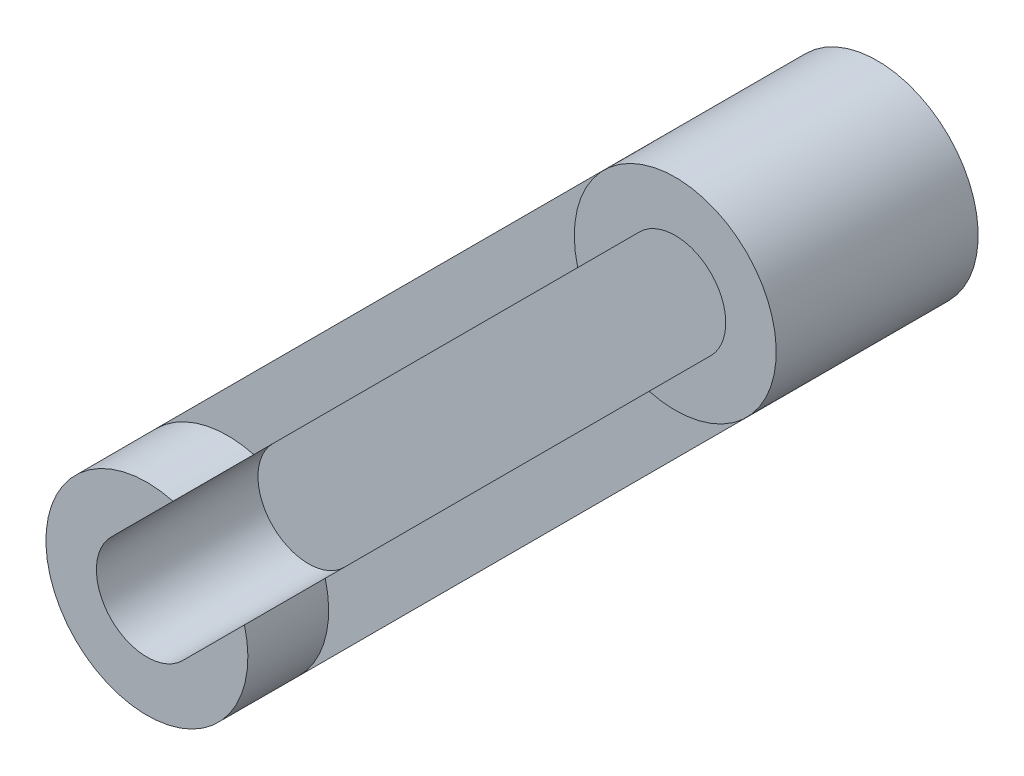
ISO-10303-21;
HEADER;
FILE_DESCRIPTION(('STEP AP214'),'2;1');
FILE_NAME('part.step','',(''),(''),'','','');
FILE_SCHEMA(('AUTOMOTIVE_DESIGN { 1 0 10303 214 1 1 1 1 }'));
ENDSEC;
DATA;
#1=APPLICATION_CONTEXT('core data for automotive mechanical design processes');
#2=APPLICATION_PROTOCOL_DEFINITION('international standard','automotive_design',2000,#1);
#3=PRODUCT_CONTEXT('',#1,'mechanical');
#4=PRODUCT('Part','Part','',(#3));
#5=PRODUCT_RELATED_PRODUCT_CATEGORY('part','',(#4));
#6=PRODUCT_DEFINITION_FORMATION('','',#4);
#7=PRODUCT_DEFINITION_CONTEXT('part definition',#1,'design');
#8=PRODUCT_DEFINITION('design','',#6,#7);
#9=PRODUCT_DEFINITION_SHAPE('','',#8);
#10=(LENGTH_UNIT() NAMED_UNIT(*) SI_UNIT(.MILLI.,.METRE.));
#11=(NAMED_UNIT(*) PLANE_ANGLE_UNIT() SI_UNIT($,.RADIAN.));
#12=(NAMED_UNIT(*) SI_UNIT($,.STERADIAN.) SOLID_ANGLE_UNIT());
#13=UNCERTAINTY_MEASURE_WITH_UNIT(LENGTH_MEASURE(1.E-05),#10,'distance_accuracy_value','');
#14=(GEOMETRIC_REPRESENTATION_CONTEXT(3) GLOBAL_UNCERTAINTY_ASSIGNED_CONTEXT((#13)) GLOBAL_UNIT_ASSIGNED_CONTEXT((#10,
#11,#12)) REPRESENTATION_CONTEXT('',''));
#15=CARTESIAN_POINT('',(0.,0.,0.));
#16=DIRECTION('',(0.,0.,1.));
#17=DIRECTION('',(1.,0.,0.));
#18=AXIS2_PLACEMENT_3D('',#15,#16,#17);
#19=CARTESIAN_POINT('',(-37.4408108069838,-24.9610251177916,10.));
#20=DIRECTION('',(0.,0.,-1.));
#21=DIRECTION('',(-1.,0.,0.));
#22=AXIS2_PLACEMENT_3D('',#19,#20,#21);
#23=CYLINDRICAL_SURFACE('',#22,2.49999999999967);
#24=DIRECTION('',(0.,0.,1.));
#25=VECTOR('',#24,1.);
#26=CARTESIAN_POINT('',(-39.2085777599503,-23.1932581648256,2.));
#27=LINE('',#26,#25);
#28=CARTESIAN_POINT('',(-39.2085777599503,-23.1932581648256,2.));
#29=VERTEX_POINT('',#28);
#30=CARTESIAN_POINT('',(-39.2085777599503,-23.1932581648256,10.));
#31=VERTEX_POINT('',#30);
#32=EDGE_CURVE('E122',#29,#31,#27,.T.);
#33=ORIENTED_EDGE('',*,*,#32,.T.);
#34=CARTESIAN_POINT('',(-37.4408108069838,-24.9610251177916,10.));
#35=DIRECTION('',(0.,0.,1.));
#36=DIRECTION('',(1.,0.,0.));
#37=AXIS2_PLACEMENT_3D('',#34,#35,#36);
#38=CIRCLE('',#37,2.49999999999967);
#39=CARTESIAN_POINT('',(-35.6730438540174,-26.728792070758,10.));
#40=VERTEX_POINT('',#39);
#41=EDGE_CURVE('E126',#31,#40,#38,.T.);
#42=ORIENTED_EDGE('',*,*,#41,.T.);
#43=DIRECTION('',(0.,0.,-1.));
#44=VECTOR('',#43,1.);
#45=CARTESIAN_POINT('',(-35.6730438540177,-26.7287920707578,10.));
#46=LINE('',#45,#44);
#47=CARTESIAN_POINT('',(-35.6730438540178,-26.7287920707577,2.));
#48=VERTEX_POINT('',#47);
#49=EDGE_CURVE('E154',#40,#48,#46,.T.);
#50=ORIENTED_EDGE('',*,*,#49,.T.);
#51=CARTESIAN_POINT('',(-37.4408108069839,-24.9610251177915,2.));
#52=DIRECTION('',(0.,0.,-1.));
#53=DIRECTION('',(-1.,0.,0.));
#54=AXIS2_PLACEMENT_3D('',#51,#52,#53);
#55=CIRCLE('',#54,2.49999999999973);
#56=EDGE_CURVE('E127',#48,#29,#55,.T.);
#57=ORIENTED_EDGE('',*,*,#56,.T.);
#58=EDGE_LOOP('',(#33,#42,#50,#57));
#59=FACE_BOUND('',#58,.T.);
#60=ADVANCED_FACE('F32',(#59),#23,.F.);
#61=CARTESIAN_POINT('',(-11.2778599030814,1.20192578611049,10.));
#62=DIRECTION('',(0.,0.,-1.));
#63=DIRECTION('',(-1.,0.,0.));
#64=AXIS2_PLACEMENT_3D('',#61,#62,#63);
#65=CYLINDRICAL_SURFACE('',#64,2.49999999999992);
#66=CARTESIAN_POINT('',(-11.2778599030814,1.20192578611049,10.));
#67=DIRECTION('',(0.,0.,1.));
#68=DIRECTION('',(1.,0.,0.));
#69=AXIS2_PLACEMENT_3D('',#66,#67,#68);
#70=CIRCLE('',#69,2.49999999999992);
#71=CARTESIAN_POINT('',(-9.51009295011515,-0.565841166855722,10.));
#72=VERTEX_POINT('',#71);
#73=CARTESIAN_POINT('',(-13.045626856048,2.96969273907715,10.));
#74=VERTEX_POINT('',#73);
#75=EDGE_CURVE('E179',#72,#74,#70,.T.);
#76=ORIENTED_EDGE('',*,*,#75,.T.);
#77=DIRECTION('',(0.,0.,1.));
#78=VECTOR('',#77,1.);
#79=CARTESIAN_POINT('',(-13.045626856048,2.96969273907715,2.));
#80=LINE('',#79,#78);
#81=CARTESIAN_POINT('',(-13.045626856048,2.96969273907715,2.));
#82=VERTEX_POINT('',#81);
#83=EDGE_CURVE('E131',#82,#74,#80,.T.);
#84=ORIENTED_EDGE('',*,*,#83,.F.);
#85=CARTESIAN_POINT('',(-11.2778599030814,1.20192578611049,2.));
#86=DIRECTION('',(0.,0.,-1.));
#87=DIRECTION('',(-1.,0.,0.));
#88=AXIS2_PLACEMENT_3D('',#85,#86,#87);
#89=CIRCLE('',#88,2.50000000000017);
#90=CARTESIAN_POINT('',(-9.51009295011489,-0.565841166855988,2.));
#91=VERTEX_POINT('',#90);
#92=EDGE_CURVE('E252',#82,#91,#89,.T.);
#93=ORIENTED_EDGE('',*,*,#92,.T.);
#94=DIRECTION('',(0.,0.,-1.));
#95=VECTOR('',#94,1.);
#96=CARTESIAN_POINT('',(-9.51009295011507,-0.565841166855805,10.));
#97=LINE('',#96,#95);
#98=EDGE_CURVE('E186',#72,#91,#97,.T.);
#99=ORIENTED_EDGE('',*,*,#98,.F.);
#100=EDGE_LOOP('',(#76,#84,#93,#99));
#101=FACE_BOUND('',#100,.T.);
#102=ADVANCED_FACE('F214',(#101),#65,.F.);
#103=CARTESIAN_POINT('',(-11.2778599030814,1.20192578611049,10.));
#104=DIRECTION('',(0.,0.,-1.));
#105=DIRECTION('',(-1.,0.,0.));
#106=AXIS2_PLACEMENT_3D('',#103,#104,#105);
#107=CYLINDRICAL_SURFACE('',#106,4.99999999999992);
#108=DIRECTION('',(0.,0.,-1.));
#109=VECTOR('',#108,1.);
#110=CARTESIAN_POINT('',(-16.1074890345268,-0.092169439401641,10.));
#111=LINE('',#110,#109);
#112=CARTESIAN_POINT('',(-16.1074890345268,-0.0921694394016501,10.));
#113=VERTEX_POINT('',#112);
#114=CARTESIAN_POINT('',(-16.1074890345268,-0.0921694394016501,6.));
#115=VERTEX_POINT('',#114);
#116=EDGE_CURVE('E211',#113,#115,#111,.T.);
#117=ORIENTED_EDGE('',*,*,#116,.F.);
#118=CARTESIAN_POINT('',(-11.2778599030814,1.20192578611049,10.));
#119=DIRECTION('',(0.,0.,1.));
#120=DIRECTION('',(1.,0.,0.));
#121=AXIS2_PLACEMENT_3D('',#118,#119,#120);
#122=CIRCLE('',#121,4.99999999999992);
#123=CARTESIAN_POINT('',(-12.5719551285942,-3.62770334533473,10.));
#124=VERTEX_POINT('',#123);
#125=EDGE_CURVE('E183',#124,#113,#122,.T.);
#126=ORIENTED_EDGE('',*,*,#125,.F.);
#127=DIRECTION('',(0.,0.,-1.));
#128=VECTOR('',#127,1.);
#129=CARTESIAN_POINT('',(-12.5719551285942,-3.62770334533473,10.));
#130=LINE('',#129,#128);
#131=CARTESIAN_POINT('',(-12.5719551285942,-3.62770334533472,6.));
#132=VERTEX_POINT('',#131);
#133=EDGE_CURVE('E264',#132,#124,#130,.F.);
#134=ORIENTED_EDGE('',*,*,#133,.F.);
#135=CARTESIAN_POINT('',(-11.2778599030814,1.20192578611049,6.));
#136=DIRECTION('',(0.,0.,1.));
#137=DIRECTION('',(1.,0.,0.));
#138=AXIS2_PLACEMENT_3D('',#135,#136,#137);
#139=CIRCLE('',#138,4.99999999999992);
#140=CARTESIAN_POINT('',(-7.74232599714873,-2.33360811982222,6.));
#141=VERTEX_POINT('',#140);
#142=EDGE_CURVE('E47',#132,#141,#139,.T.);
#143=ORIENTED_EDGE('',*,*,#142,.T.);
#144=DIRECTION('',(0.,0.,-1.));
#145=VECTOR('',#144,1.);
#146=CARTESIAN_POINT('',(-7.74232599714877,-2.33360811982225,6.));
#147=LINE('',#146,#145);
#148=CARTESIAN_POINT('',(-7.74232599714877,-2.33360811982225,0.));
#149=VERTEX_POINT('',#148);
#150=EDGE_CURVE('E165',#141,#149,#147,.T.);
#151=ORIENTED_EDGE('',*,*,#150,.T.);
#152=CARTESIAN_POINT('',(-11.2778599030814,1.20192578611049,0.));
#153=DIRECTION('',(0.,0.,1.));
#154=DIRECTION('',(1.,0.,0.));
#155=AXIS2_PLACEMENT_3D('',#152,#153,#154);
#156=CIRCLE('',#155,4.99999999999992);
#157=CARTESIAN_POINT('',(-14.8133938090141,4.73745969204318,0.));
#158=VERTEX_POINT('',#157);
#159=EDGE_CURVE('E182',#149,#158,#156,.T.);
#160=ORIENTED_EDGE('',*,*,#159,.T.);
#161=DIRECTION('',(0.,0.,-1.));
#162=VECTOR('',#161,1.);
#163=CARTESIAN_POINT('',(-14.8133938090141,4.73745969204314,6.));
#164=LINE('',#163,#162);
#165=CARTESIAN_POINT('',(-14.8133938090141,4.73745969204318,6.));
#166=VERTEX_POINT('',#165);
#167=EDGE_CURVE('E54',#166,#158,#164,.T.);
#168=ORIENTED_EDGE('',*,*,#167,.F.);
#169=EDGE_CURVE('E177',#166,#115,#139,.T.);
#170=ORIENTED_EDGE('',*,*,#169,.T.);
#171=EDGE_LOOP('',(#117,#126,#134,#143,#151,#160,#168,#170));
#172=FACE_BOUND('',#171,.T.);
#173=ADVANCED_FACE('F34',(#172),#107,.T.);
#174=CARTESIAN_POINT('',(-11.2778599030814,1.20192578611049,10.));
#175=DIRECTION('',(0.,0.,1.));
#176=DIRECTION('',(1.,0.,0.));
#177=AXIS2_PLACEMENT_3D('',#174,#175,#176);
#178=PLANE('',#177);
#179=ORIENTED_EDGE('',*,*,#125,.T.);
#180=DIRECTION('',(-0.707106781186542,-0.707106781186553,0.));
#181=VECTOR('',#180,1.);
#182=CARTESIAN_POINT('',(-39.2085777599503,-23.1932581648256,10.));
#183=LINE('',#182,#181);
#184=EDGE_CURVE('E142',#74,#113,#183,.T.);
#185=ORIENTED_EDGE('',*,*,#184,.F.);
#186=ORIENTED_EDGE('',*,*,#75,.F.);
#187=DIRECTION('',(0.707106781186547,0.707106781186547,0.));
#188=VECTOR('',#187,1.);
#189=CARTESIAN_POINT('',(-9.51009295011515,-0.565841166855722,10.));
#190=LINE('',#189,#188);
#191=EDGE_CURVE('E268',#124,#72,#190,.T.);
#192=ORIENTED_EDGE('',*,*,#191,.F.);
#193=EDGE_LOOP('',(#179,#185,#186,#192));
#194=FACE_BOUND('',#193,.T.);
#195=ADVANCED_FACE('F213',(#194),#178,.T.);
#196=CARTESIAN_POINT('',(-37.4408108069838,-24.9610251177916,10.));
#197=DIRECTION('',(0.,0.,1.));
#198=DIRECTION('',(1.,0.,0.));
#199=AXIS2_PLACEMENT_3D('',#196,#197,#198);
#200=PLANE('',#199);
#201=ORIENTED_EDGE('',*,*,#41,.F.);
#202=CARTESIAN_POINT('',(-36.1467155814714,-20.1313959863466,10.));
#203=VERTEX_POINT('',#202);
#204=EDGE_CURVE('E135',#203,#31,#183,.T.);
#205=ORIENTED_EDGE('',*,*,#204,.F.);
#206=CARTESIAN_POINT('',(-37.4408108069838,-24.9610251177916,10.));
#207=DIRECTION('',(0.,0.,1.));
#208=DIRECTION('',(1.,0.,0.));
#209=AXIS2_PLACEMENT_3D('',#206,#207,#208);
#210=CIRCLE('',#209,4.99999999999966);
#211=CARTESIAN_POINT('',(-32.6111816755387,-23.6669298922793,10.));
#212=VERTEX_POINT('',#211);
#213=EDGE_CURVE('E150',#203,#212,#210,.T.);
#214=ORIENTED_EDGE('',*,*,#213,.T.);
#215=EDGE_CURVE('E146',#40,#212,#190,.T.);
#216=ORIENTED_EDGE('',*,*,#215,.F.);
#217=EDGE_LOOP('',(#201,#205,#214,#216));
#218=FACE_BOUND('',#217,.T.);
#219=ADVANCED_FACE('F145',(#218),#200,.T.);
#220=CARTESIAN_POINT('',(-37.4408108069838,-24.9610251177916,10.));
#221=DIRECTION('',(0.,0.,-1.));
#222=DIRECTION('',(-1.,0.,0.));
#223=AXIS2_PLACEMENT_3D('',#220,#221,#222);
#224=CYLINDRICAL_SURFACE('',#223,4.99999999999966);
#225=DIRECTION('',(0.,0.,-1.));
#226=VECTOR('',#225,1.);
#227=CARTESIAN_POINT('',(-36.1467155814714,-20.1313959863466,10.));
#228=LINE('',#227,#226);
#229=CARTESIAN_POINT('',(-36.1467155814714,-20.1313959863466,6.));
#230=VERTEX_POINT('',#229);
#231=EDGE_CURVE('E138',#230,#203,#228,.F.);
#232=ORIENTED_EDGE('',*,*,#231,.F.);
#233=CARTESIAN_POINT('',(-37.4408108069838,-24.9610251177916,6.));
#234=DIRECTION('',(0.,0.,1.));
#235=DIRECTION('',(1.,0.,0.));
#236=AXIS2_PLACEMENT_3D('',#233,#234,#235);
#237=CIRCLE('',#236,4.99999999999966);
#238=CARTESIAN_POINT('',(-40.9763447129165,-21.425491211859,6.));
#239=VERTEX_POINT('',#238);
#240=EDGE_CURVE('E11',#239,#230,#237,.F.);
#241=ORIENTED_EDGE('',*,*,#240,.F.);
#242=DIRECTION('',(0.,0.,-1.));
#243=VECTOR('',#242,1.);
#244=CARTESIAN_POINT('',(-40.9763447129165,-21.425491211859,6.));
#245=LINE('',#244,#243);
#246=CARTESIAN_POINT('',(-40.9763447129165,-21.425491211859,0.));
#247=VERTEX_POINT('',#246);
#248=EDGE_CURVE('E171',#239,#247,#245,.T.);
#249=ORIENTED_EDGE('',*,*,#248,.T.);
#250=CARTESIAN_POINT('',(-37.4408108069838,-24.9610251177916,0.));
#251=DIRECTION('',(0.,0.,1.));
#252=DIRECTION('',(1.,0.,0.));
#253=AXIS2_PLACEMENT_3D('',#250,#251,#252);
#254=CIRCLE('',#253,4.99999999999966);
#255=CARTESIAN_POINT('',(-33.9052769010512,-28.4965590237244,0.));
#256=VERTEX_POINT('',#255);
#257=EDGE_CURVE('E147',#247,#256,#254,.T.);
#258=ORIENTED_EDGE('',*,*,#257,.T.);
#259=DIRECTION('',(0.,0.,-1.));
#260=VECTOR('',#259,1.);
#261=CARTESIAN_POINT('',(-33.9052769010512,-28.4965590237244,6.));
#262=LINE('',#261,#260);
#263=CARTESIAN_POINT('',(-33.9052769010512,-28.4965590237244,6.));
#264=VERTEX_POINT('',#263);
#265=EDGE_CURVE('E174',#264,#256,#262,.T.);
#266=ORIENTED_EDGE('',*,*,#265,.F.);
#267=CARTESIAN_POINT('',(-32.6111816755387,-23.6669298922793,6.));
#268=VERTEX_POINT('',#267);
#269=EDGE_CURVE('E40',#268,#264,#237,.F.);
#270=ORIENTED_EDGE('',*,*,#269,.F.);
#271=DIRECTION('',(0.,0.,-1.));
#272=VECTOR('',#271,1.);
#273=CARTESIAN_POINT('',(-32.6111816755387,-23.6669298922793,10.));
#274=LINE('',#273,#272);
#275=EDGE_CURVE('E266',#212,#268,#274,.T.);
#276=ORIENTED_EDGE('',*,*,#275,.F.);
#277=ORIENTED_EDGE('',*,*,#213,.F.);
#278=EDGE_LOOP('',(#232,#241,#249,#258,#266,#270,#276,#277));
#279=FACE_BOUND('',#278,.T.);
#280=ADVANCED_FACE('F204',(#279),#224,.T.);
#281=CARTESIAN_POINT('',(0.,0.,6.));
#282=DIRECTION('',(0.,0.,1.));
#283=DIRECTION('',(1.,0.,0.));
#284=AXIS2_PLACEMENT_3D('',#281,#282,#283);
#285=PLANE('',#284);
#286=DIRECTION('',(-0.707106781186542,-0.707106781186553,0.));
#287=VECTOR('',#286,1.);
#288=CARTESIAN_POINT('',(-39.2085777599503,-23.1932581648256,6.));
#289=LINE('',#288,#287);
#290=EDGE_CURVE('E250',#115,#230,#289,.T.);
#291=ORIENTED_EDGE('',*,*,#290,.F.);
#292=ORIENTED_EDGE('',*,*,#169,.F.);
#293=DIRECTION('',(0.707106781186551,0.707106781186544,0.));
#294=VECTOR('',#293,1.);
#295=CARTESIAN_POINT('',(-14.8133938090141,4.73745969204314,6.));
#296=LINE('',#295,#294);
#297=EDGE_CURVE('E161',#239,#166,#296,.T.);
#298=ORIENTED_EDGE('',*,*,#297,.F.);
#299=ORIENTED_EDGE('',*,*,#240,.T.);
#300=EDGE_LOOP('',(#291,#292,#298,#299));
#301=FACE_BOUND('',#300,.T.);
#302=ADVANCED_FACE('F234',(#301),#285,.T.);
#303=CARTESIAN_POINT('',(-11.2778599030814,1.20192578611049,0.));
#304=DIRECTION('',(0.,0.,1.));
#305=DIRECTION('',(1.,0.,0.));
#306=AXIS2_PLACEMENT_3D('',#303,#304,#305);
#307=PLANE('',#306);
#308=DIRECTION('',(-0.707106781186552,-0.707106781186544,0.));
#309=VECTOR('',#308,1.);
#310=CARTESIAN_POINT('',(-33.9052769010512,-28.4965590237244,0.));
#311=LINE('',#310,#309);
#312=EDGE_CURVE('E157',#149,#256,#311,.T.);
#313=ORIENTED_EDGE('',*,*,#312,.T.);
#314=ORIENTED_EDGE('',*,*,#257,.F.);
#315=DIRECTION('',(0.707106781186551,0.707106781186544,0.));
#316=VECTOR('',#315,1.);
#317=CARTESIAN_POINT('',(-14.8133938090141,4.73745969204314,0.));
#318=LINE('',#317,#316);
#319=EDGE_CURVE('E162',#247,#158,#318,.T.);
#320=ORIENTED_EDGE('',*,*,#319,.T.);
#321=ORIENTED_EDGE('',*,*,#159,.F.);
#322=EDGE_LOOP('',(#313,#314,#320,#321));
#323=FACE_BOUND('',#322,.T.);
#324=ADVANCED_FACE('F208',(#323),#307,.F.);
#325=CARTESIAN_POINT('',(-14.8133938090141,4.73745969204314,6.));
#326=DIRECTION('',(-0.707106781186544,0.707106781186551,0.));
#327=DIRECTION('',(-0.707106781186551,-0.707106781186544,0.));
#328=AXIS2_PLACEMENT_3D('',#325,#326,#327);
#329=PLANE('',#328);
#330=ORIENTED_EDGE('',*,*,#319,.F.);
#331=ORIENTED_EDGE('',*,*,#248,.F.);
#332=ORIENTED_EDGE('',*,*,#297,.T.);
#333=ORIENTED_EDGE('',*,*,#167,.T.);
#334=EDGE_LOOP('',(#330,#331,#332,#333));
#335=FACE_BOUND('',#334,.T.);
#336=ADVANCED_FACE('F237',(#335),#329,.T.);
#337=CARTESIAN_POINT('',(-33.9052769010512,-28.4965590237244,6.));
#338=DIRECTION('',(0.707106781186544,-0.707106781186551,0.));
#339=DIRECTION('',(0.707106781186551,0.707106781186544,0.));
#340=AXIS2_PLACEMENT_3D('',#337,#338,#339);
#341=PLANE('',#340);
#342=ORIENTED_EDGE('',*,*,#312,.F.);
#343=ORIENTED_EDGE('',*,*,#150,.F.);
#344=DIRECTION('',(-0.707106781186552,-0.707106781186544,0.));
#345=VECTOR('',#344,1.);
#346=CARTESIAN_POINT('',(-33.9052769010512,-28.4965590237244,6.));
#347=LINE('',#346,#345);
#348=EDGE_CURVE('E158',#141,#264,#347,.T.);
#349=ORIENTED_EDGE('',*,*,#348,.T.);
#350=ORIENTED_EDGE('',*,*,#265,.T.);
#351=EDGE_LOOP('',(#342,#343,#349,#350));
#352=FACE_BOUND('',#351,.T.);
#353=ADVANCED_FACE('F203',(#352),#341,.T.);
#354=DIRECTION('',(0.707106781186547,0.707106781186547,0.));
#355=VECTOR('',#354,1.);
#356=CARTESIAN_POINT('',(-9.51009295011515,-0.565841166855722,6.));
#357=LINE('',#356,#355);
#358=EDGE_CURVE('E197',#268,#132,#357,.T.);
#359=ORIENTED_EDGE('',*,*,#358,.F.);
#360=ORIENTED_EDGE('',*,*,#269,.T.);
#361=ORIENTED_EDGE('',*,*,#348,.F.);
#362=ORIENTED_EDGE('',*,*,#142,.F.);
#363=EDGE_LOOP('',(#359,#360,#361,#362));
#364=FACE_BOUND('',#363,.T.);
#365=ADVANCED_FACE('F195',(#364),#285,.T.);
#366=CARTESIAN_POINT('',(-39.2085777599503,-23.1932581648256,2.));
#367=DIRECTION('',(-0.707106781186553,0.707106781186542,0.));
#368=DIRECTION('',(-0.707106781186542,-0.707106781186553,0.));
#369=AXIS2_PLACEMENT_3D('',#366,#367,#368);
#370=PLANE('',#369);
#371=ORIENTED_EDGE('',*,*,#83,.T.);
#372=ORIENTED_EDGE('',*,*,#184,.T.);
#373=ORIENTED_EDGE('',*,*,#116,.T.);
#374=ORIENTED_EDGE('',*,*,#290,.T.);
#375=ORIENTED_EDGE('',*,*,#231,.T.);
#376=ORIENTED_EDGE('',*,*,#204,.T.);
#377=ORIENTED_EDGE('',*,*,#32,.F.);
#378=DIRECTION('',(-0.707106781186542,-0.707106781186553,0.));
#379=VECTOR('',#378,1.);
#380=CARTESIAN_POINT('',(-39.2085777599503,-23.1932581648256,2.));
#381=LINE('',#380,#379);
#382=EDGE_CURVE('E254',#82,#29,#381,.T.);
#383=ORIENTED_EDGE('',*,*,#382,.F.);
#384=EDGE_LOOP('',(#371,#372,#373,#374,#375,#376,#377,#383));
#385=FACE_BOUND('',#384,.T.);
#386=ADVANCED_FACE('F136',(#385),#370,.F.);
#387=CARTESIAN_POINT('',(-9.51009295011515,-0.565841166855722,2.));
#388=DIRECTION('',(0.707106781186548,-0.707106781186548,0.));
#389=DIRECTION('',(0.707106781186547,0.707106781186548,0.));
#390=AXIS2_PLACEMENT_3D('',#387,#388,#389);
#391=PLANE('',#390);
#392=ORIENTED_EDGE('',*,*,#49,.F.);
#393=ORIENTED_EDGE('',*,*,#215,.T.);
#394=ORIENTED_EDGE('',*,*,#275,.T.);
#395=ORIENTED_EDGE('',*,*,#358,.T.);
#396=ORIENTED_EDGE('',*,*,#133,.T.);
#397=ORIENTED_EDGE('',*,*,#191,.T.);
#398=ORIENTED_EDGE('',*,*,#98,.T.);
#399=DIRECTION('',(0.707106781186547,0.707106781186547,0.));
#400=VECTOR('',#399,1.);
#401=CARTESIAN_POINT('',(-9.51009295011515,-0.565841166855722,2.));
#402=LINE('',#401,#400);
#403=EDGE_CURVE('E132',#48,#91,#402,.T.);
#404=ORIENTED_EDGE('',*,*,#403,.F.);
#405=EDGE_LOOP('',(#392,#393,#394,#395,#396,#397,#398,#404));
#406=FACE_BOUND('',#405,.T.);
#407=ADVANCED_FACE('F272',(#406),#391,.F.);
#408=CARTESIAN_POINT('',(0.,0.,2.));
#409=DIRECTION('',(0.,0.,-1.));
#410=DIRECTION('',(-1.,0.,0.));
#411=AXIS2_PLACEMENT_3D('',#408,#409,#410);
#412=PLANE('',#411);
#413=ORIENTED_EDGE('',*,*,#382,.T.);
#414=ORIENTED_EDGE('',*,*,#56,.F.);
#415=ORIENTED_EDGE('',*,*,#403,.T.);
#416=ORIENTED_EDGE('',*,*,#92,.F.);
#417=EDGE_LOOP('',(#413,#414,#415,#416));
#418=FACE_BOUND('',#417,.T.);
#419=ADVANCED_FACE('F275',(#418),#412,.F.);
#420=CLOSED_SHELL('',(#60,#102,#173,#195,#219,#280,#302,#324,#336,#353,#365,#386,#407,#419));
#421=MANIFOLD_SOLID_BREP('B2',#420);
#422=ADVANCED_BREP_SHAPE_REPRESENTATION('',(#18,#421),#14);
#423=SHAPE_DEFINITION_REPRESENTATION(#9,#422);
ENDSEC;
END-ISO-10303-21;
